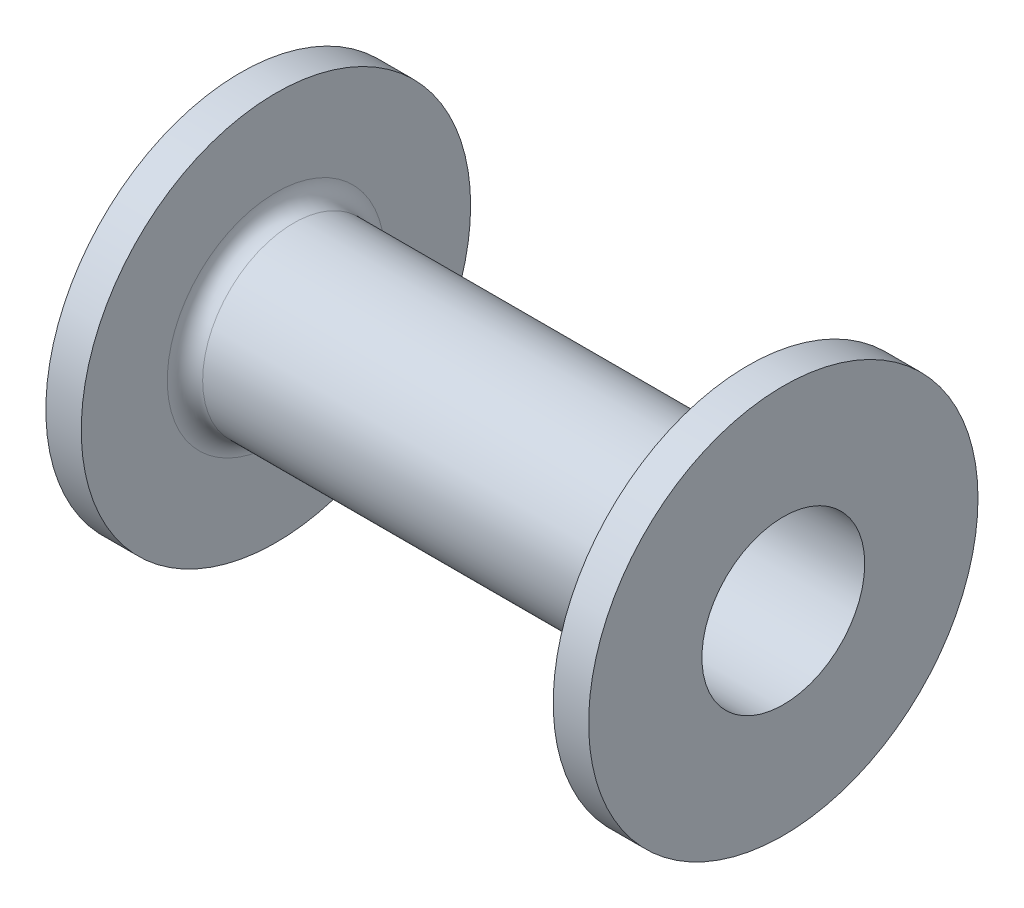
ISO-10303-21;
HEADER;
FILE_DESCRIPTION(('STEP AP214'),'2;1');
FILE_NAME('part.step','',(''),(''),'','','');
FILE_SCHEMA(('AUTOMOTIVE_DESIGN { 1 0 10303 214 1 1 1 1 }'));
ENDSEC;
DATA;
#1=APPLICATION_CONTEXT('core data for automotive mechanical design processes');
#2=APPLICATION_PROTOCOL_DEFINITION('international standard','automotive_design',2000,#1);
#3=PRODUCT_CONTEXT('',#1,'mechanical');
#4=PRODUCT('Part','Part','',(#3));
#5=PRODUCT_RELATED_PRODUCT_CATEGORY('part','',(#4));
#6=PRODUCT_DEFINITION_FORMATION('','',#4);
#7=PRODUCT_DEFINITION_CONTEXT('part definition',#1,'design');
#8=PRODUCT_DEFINITION('design','',#6,#7);
#9=PRODUCT_DEFINITION_SHAPE('','',#8);
#10=(LENGTH_UNIT() NAMED_UNIT(*) SI_UNIT(.MILLI.,.METRE.));
#11=(NAMED_UNIT(*) PLANE_ANGLE_UNIT() SI_UNIT($,.RADIAN.));
#12=(NAMED_UNIT(*) SI_UNIT($,.STERADIAN.) SOLID_ANGLE_UNIT());
#13=UNCERTAINTY_MEASURE_WITH_UNIT(LENGTH_MEASURE(1.E-05),#10,'distance_accuracy_value','');
#14=(GEOMETRIC_REPRESENTATION_CONTEXT(3) GLOBAL_UNCERTAINTY_ASSIGNED_CONTEXT((#13)) GLOBAL_UNIT_ASSIGNED_CONTEXT((#10,
#11,#12)) REPRESENTATION_CONTEXT('',''));
#15=CARTESIAN_POINT('',(0.,0.,0.));
#16=DIRECTION('',(0.,0.,1.));
#17=DIRECTION('',(1.,0.,0.));
#18=AXIS2_PLACEMENT_3D('',#15,#16,#17);
#19=CARTESIAN_POINT('',(0.,0.,0.));
#20=DIRECTION('',(1.,0.,0.));
#21=DIRECTION('',(0.,0.,-1.));
#22=AXIS2_PLACEMENT_3D('',#19,#20,#21);
#23=CYLINDRICAL_SURFACE('',#22,16.5);
#24=CARTESIAN_POINT('',(0.,0.,0.));
#25=DIRECTION('',(1.,0.,0.));
#26=DIRECTION('',(0.,0.,-1.));
#27=AXIS2_PLACEMENT_3D('',#24,#25,#26);
#28=CIRCLE('',#27,16.5);
#29=CARTESIAN_POINT('',(0.,0.,-16.5));
#30=VERTEX_POINT('',#29);
#31=EDGE_CURVE('E68',#30,#30,#28,.T.);
#32=ORIENTED_EDGE('',*,*,#31,.T.);
#33=EDGE_LOOP('',(#32));
#34=FACE_BOUND('',#33,.T.);
#35=CARTESIAN_POINT('',(3.,0.,0.));
#36=DIRECTION('',(1.,0.,0.));
#37=DIRECTION('',(0.,0.,-1.));
#38=AXIS2_PLACEMENT_3D('',#35,#36,#37);
#39=CIRCLE('',#38,16.5);
#40=CARTESIAN_POINT('',(3.,0.,-16.5));
#41=VERTEX_POINT('',#40);
#42=EDGE_CURVE('E10',#41,#41,#39,.T.);
#43=ORIENTED_EDGE('',*,*,#42,.F.);
#44=EDGE_LOOP('',(#43));
#45=FACE_BOUND('',#44,.T.);
#46=ADVANCED_FACE('F34',(#34,#45),#23,.T.);
#47=CARTESIAN_POINT('',(3.,16.5,0.));
#48=DIRECTION('',(1.,0.,0.));
#49=DIRECTION('',(0.,0.,-1.));
#50=AXIS2_PLACEMENT_3D('',#47,#48,#49);
#51=PLANE('',#50);
#52=ORIENTED_EDGE('',*,*,#42,.T.);
#53=EDGE_LOOP('',(#52));
#54=FACE_BOUND('',#53,.T.);
#55=CARTESIAN_POINT('',(3.,0.,0.));
#56=DIRECTION('',(1.,0.,0.));
#57=DIRECTION('',(0.,0.,-1.));
#58=AXIS2_PLACEMENT_3D('',#55,#56,#57);
#59=CIRCLE('',#58,9.21);
#60=CARTESIAN_POINT('',(3.,0.,-9.21));
#61=VERTEX_POINT('',#60);
#62=EDGE_CURVE('E40',#61,#61,#59,.T.);
#63=ORIENTED_EDGE('',*,*,#62,.F.);
#64=EDGE_LOOP('',(#63));
#65=FACE_BOUND('',#64,.T.);
#66=ADVANCED_FACE('F86',(#54,#65),#51,.T.);
#67=CARTESIAN_POINT('',(4.5,0.,0.));
#68=DIRECTION('',(1.,0.,0.));
#69=DIRECTION('',(0.,0.,-1.));
#70=AXIS2_PLACEMENT_3D('',#67,#68,#69);
#71=TOROIDAL_SURFACE('',#70,9.21,1.5);
#72=ORIENTED_EDGE('',*,*,#62,.T.);
#73=EDGE_LOOP('',(#72));
#74=FACE_BOUND('',#73,.T.);
#75=CARTESIAN_POINT('',(4.5,0.,0.));
#76=DIRECTION('',(1.,0.,0.));
#77=DIRECTION('',(0.,0.,-1.));
#78=AXIS2_PLACEMENT_3D('',#75,#76,#77);
#79=CIRCLE('',#78,7.71);
#80=CARTESIAN_POINT('',(4.5,0.,-7.71));
#81=VERTEX_POINT('',#80);
#82=EDGE_CURVE('E44',#81,#81,#79,.T.);
#83=ORIENTED_EDGE('',*,*,#82,.F.);
#84=EDGE_LOOP('',(#83));
#85=FACE_BOUND('',#84,.T.);
#86=ADVANCED_FACE('F90',(#74,#85),#71,.F.);
#87=CARTESIAN_POINT('',(0.,0.,0.));
#88=DIRECTION('',(1.,0.,0.));
#89=DIRECTION('',(0.,0.,-1.));
#90=AXIS2_PLACEMENT_3D('',#87,#88,#89);
#91=CYLINDRICAL_SURFACE('',#90,7.71);
#92=ORIENTED_EDGE('',*,*,#82,.T.);
#93=EDGE_LOOP('',(#92));
#94=FACE_BOUND('',#93,.T.);
#95=CARTESIAN_POINT('',(41.5,0.,0.));
#96=DIRECTION('',(1.,0.,0.));
#97=DIRECTION('',(0.,0.,-1.));
#98=AXIS2_PLACEMENT_3D('',#95,#96,#97);
#99=CIRCLE('',#98,7.71);
#100=CARTESIAN_POINT('',(41.5,0.,-7.71));
#101=VERTEX_POINT('',#100);
#102=EDGE_CURVE('E48',#101,#101,#99,.T.);
#103=ORIENTED_EDGE('',*,*,#102,.F.);
#104=EDGE_LOOP('',(#103));
#105=FACE_BOUND('',#104,.T.);
#106=ADVANCED_FACE('F94',(#94,#105),#91,.T.);
#107=CARTESIAN_POINT('',(41.5,0.,0.));
#108=DIRECTION('',(1.,0.,0.));
#109=DIRECTION('',(0.,0.,-1.));
#110=AXIS2_PLACEMENT_3D('',#107,#108,#109);
#111=TOROIDAL_SURFACE('',#110,9.21,1.5);
#112=ORIENTED_EDGE('',*,*,#102,.T.);
#113=EDGE_LOOP('',(#112));
#114=FACE_BOUND('',#113,.T.);
#115=CARTESIAN_POINT('',(43.,0.,0.));
#116=DIRECTION('',(1.,0.,0.));
#117=DIRECTION('',(0.,0.,-1.));
#118=AXIS2_PLACEMENT_3D('',#115,#116,#117);
#119=CIRCLE('',#118,9.21);
#120=CARTESIAN_POINT('',(43.,0.,-9.21));
#121=VERTEX_POINT('',#120);
#122=EDGE_CURVE('E53',#121,#121,#119,.T.);
#123=ORIENTED_EDGE('',*,*,#122,.F.);
#124=EDGE_LOOP('',(#123));
#125=FACE_BOUND('',#124,.T.);
#126=ADVANCED_FACE('F100',(#114,#125),#111,.F.);
#127=CARTESIAN_POINT('',(43.,9.21,0.));
#128=DIRECTION('',(-1.,0.,0.));
#129=DIRECTION('',(0.,0.,1.));
#130=AXIS2_PLACEMENT_3D('',#127,#128,#129);
#131=PLANE('',#130);
#132=ORIENTED_EDGE('',*,*,#122,.T.);
#133=EDGE_LOOP('',(#132));
#134=FACE_BOUND('',#133,.T.);
#135=CARTESIAN_POINT('',(43.,0.,0.));
#136=DIRECTION('',(1.,0.,0.));
#137=DIRECTION('',(0.,0.,-1.));
#138=AXIS2_PLACEMENT_3D('',#135,#136,#137);
#139=CIRCLE('',#138,16.5);
#140=CARTESIAN_POINT('',(43.,0.,-16.5));
#141=VERTEX_POINT('',#140);
#142=EDGE_CURVE('E56',#141,#141,#139,.T.);
#143=ORIENTED_EDGE('',*,*,#142,.F.);
#144=EDGE_LOOP('',(#143));
#145=FACE_BOUND('',#144,.T.);
#146=ADVANCED_FACE('F104',(#134,#145),#131,.T.);
#147=CARTESIAN_POINT('',(0.,0.,0.));
#148=DIRECTION('',(1.,0.,0.));
#149=DIRECTION('',(0.,0.,-1.));
#150=AXIS2_PLACEMENT_3D('',#147,#148,#149);
#151=CYLINDRICAL_SURFACE('',#150,16.5);
#152=ORIENTED_EDGE('',*,*,#142,.T.);
#153=EDGE_LOOP('',(#152));
#154=FACE_BOUND('',#153,.T.);
#155=CARTESIAN_POINT('',(46.,0.,0.));
#156=DIRECTION('',(1.,0.,0.));
#157=DIRECTION('',(0.,0.,-1.));
#158=AXIS2_PLACEMENT_3D('',#155,#156,#157);
#159=CIRCLE('',#158,16.5);
#160=CARTESIAN_POINT('',(46.,0.,-16.5));
#161=VERTEX_POINT('',#160);
#162=EDGE_CURVE('E59',#161,#161,#159,.T.);
#163=ORIENTED_EDGE('',*,*,#162,.F.);
#164=EDGE_LOOP('',(#163));
#165=FACE_BOUND('',#164,.T.);
#166=ADVANCED_FACE('F108',(#154,#165),#151,.T.);
#167=CARTESIAN_POINT('',(46.,16.5,0.));
#168=DIRECTION('',(1.,0.,0.));
#169=DIRECTION('',(0.,0.,-1.));
#170=AXIS2_PLACEMENT_3D('',#167,#168,#169);
#171=PLANE('',#170);
#172=ORIENTED_EDGE('',*,*,#162,.T.);
#173=EDGE_LOOP('',(#172));
#174=FACE_BOUND('',#173,.T.);
#175=CARTESIAN_POINT('',(46.,0.,0.));
#176=DIRECTION('',(1.,0.,0.));
#177=DIRECTION('',(0.,0.,-1.));
#178=AXIS2_PLACEMENT_3D('',#175,#176,#177);
#179=CIRCLE('',#178,6.9);
#180=CARTESIAN_POINT('',(46.,0.,-6.9));
#181=VERTEX_POINT('',#180);
#182=EDGE_CURVE('E62',#181,#181,#179,.T.);
#183=ORIENTED_EDGE('',*,*,#182,.F.);
#184=EDGE_LOOP('',(#183));
#185=FACE_BOUND('',#184,.T.);
#186=ADVANCED_FACE('F82',(#174,#185),#171,.T.);
#187=CARTESIAN_POINT('',(0.,0.,0.));
#188=DIRECTION('',(1.,0.,0.));
#189=DIRECTION('',(0.,0.,-1.));
#190=AXIS2_PLACEMENT_3D('',#187,#188,#189);
#191=CYLINDRICAL_SURFACE('',#190,6.9);
#192=ORIENTED_EDGE('',*,*,#182,.T.);
#193=EDGE_LOOP('',(#192));
#194=FACE_BOUND('',#193,.T.);
#195=CARTESIAN_POINT('',(0.,0.,0.));
#196=DIRECTION('',(1.,0.,0.));
#197=DIRECTION('',(0.,0.,-1.));
#198=AXIS2_PLACEMENT_3D('',#195,#196,#197);
#199=CIRCLE('',#198,6.9);
#200=CARTESIAN_POINT('',(0.,0.,-6.9));
#201=VERTEX_POINT('',#200);
#202=EDGE_CURVE('E65',#201,#201,#199,.T.);
#203=ORIENTED_EDGE('',*,*,#202,.F.);
#204=EDGE_LOOP('',(#203));
#205=FACE_BOUND('',#204,.T.);
#206=ADVANCED_FACE('F76',(#194,#205),#191,.F.);
#207=CARTESIAN_POINT('',(0.,6.9,0.));
#208=DIRECTION('',(-1.,0.,0.));
#209=DIRECTION('',(0.,0.,1.));
#210=AXIS2_PLACEMENT_3D('',#207,#208,#209);
#211=PLANE('',#210);
#212=ORIENTED_EDGE('',*,*,#202,.T.);
#213=EDGE_LOOP('',(#212));
#214=FACE_BOUND('',#213,.T.);
#215=ORIENTED_EDGE('',*,*,#31,.F.);
#216=EDGE_LOOP('',(#215));
#217=FACE_BOUND('',#216,.T.);
#218=ADVANCED_FACE('F74',(#214,#217),#211,.T.);
#219=CLOSED_SHELL('',(#46,#66,#86,#106,#126,#146,#166,#186,#206,#218));
#220=MANIFOLD_SOLID_BREP('B2',#219);
#221=ADVANCED_BREP_SHAPE_REPRESENTATION('',(#18,#220),#14);
#222=SHAPE_DEFINITION_REPRESENTATION(#9,#221);
ENDSEC;
END-ISO-10303-21;
